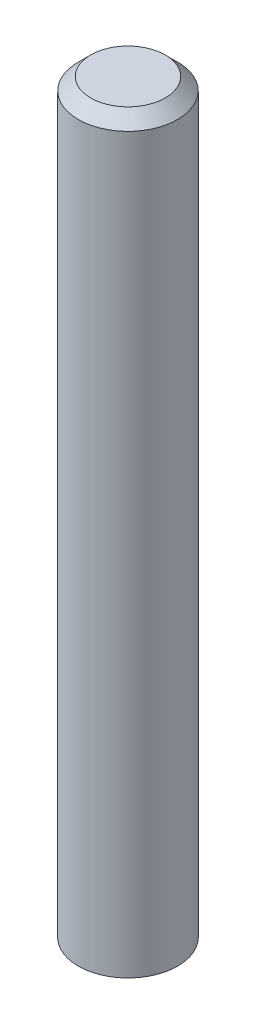
ISO-10303-21;
HEADER;
FILE_DESCRIPTION(('STEP AP214'),'2;1');
FILE_NAME('part.step','',(''),(''),'','','');
FILE_SCHEMA(('AUTOMOTIVE_DESIGN { 1 0 10303 214 1 1 1 1 }'));
ENDSEC;
DATA;
#1=APPLICATION_CONTEXT('core data for automotive mechanical design processes');
#2=APPLICATION_PROTOCOL_DEFINITION('international standard','automotive_design',2000,#1);
#3=PRODUCT_CONTEXT('',#1,'mechanical');
#4=PRODUCT('Part','Part','',(#3));
#5=PRODUCT_RELATED_PRODUCT_CATEGORY('part','',(#4));
#6=PRODUCT_DEFINITION_FORMATION('','',#4);
#7=PRODUCT_DEFINITION_CONTEXT('part definition',#1,'design');
#8=PRODUCT_DEFINITION('design','',#6,#7);
#9=PRODUCT_DEFINITION_SHAPE('','',#8);
#10=(LENGTH_UNIT() NAMED_UNIT(*) SI_UNIT(.MILLI.,.METRE.));
#11=(NAMED_UNIT(*) PLANE_ANGLE_UNIT() SI_UNIT($,.RADIAN.));
#12=(NAMED_UNIT(*) SI_UNIT($,.STERADIAN.) SOLID_ANGLE_UNIT());
#13=UNCERTAINTY_MEASURE_WITH_UNIT(LENGTH_MEASURE(1.E-05),#10,'distance_accuracy_value','');
#14=(GEOMETRIC_REPRESENTATION_CONTEXT(3) GLOBAL_UNCERTAINTY_ASSIGNED_CONTEXT((#13)) GLOBAL_UNIT_ASSIGNED_CONTEXT((#10,
#11,#12)) REPRESENTATION_CONTEXT('',''));
#15=CARTESIAN_POINT('',(0.,0.,0.));
#16=DIRECTION('',(0.,0.,1.));
#17=DIRECTION('',(1.,0.,0.));
#18=AXIS2_PLACEMENT_3D('',#15,#16,#17);
#19=CARTESIAN_POINT('',(0.,60.,0.));
#20=DIRECTION('',(0.,-1.,0.));
#21=DIRECTION('',(0.,0.,-1.));
#22=AXIS2_PLACEMENT_3D('',#19,#20,#21);
#23=CYLINDRICAL_SURFACE('',#22,4.);
#24=CARTESIAN_POINT('',(0.,59.,0.));
#25=DIRECTION('',(0.,1.,0.));
#26=DIRECTION('',(0.,0.,1.));
#27=AXIS2_PLACEMENT_3D('',#24,#25,#26);
#28=CIRCLE('',#27,4.);
#29=CARTESIAN_POINT('',(0.,59.,4.));
#30=VERTEX_POINT('',#29);
#31=EDGE_CURVE('E10',#30,#30,#28,.F.);
#32=ORIENTED_EDGE('',*,*,#31,.T.);
#33=EDGE_LOOP('',(#32));
#34=FACE_BOUND('',#33,.T.);
#35=CARTESIAN_POINT('',(0.,0.,0.));
#36=DIRECTION('',(0.,1.,0.));
#37=DIRECTION('',(0.,0.,1.));
#38=AXIS2_PLACEMENT_3D('',#35,#36,#37);
#39=CIRCLE('',#38,4.);
#40=CARTESIAN_POINT('',(0.,0.,4.));
#41=VERTEX_POINT('',#40);
#42=EDGE_CURVE('E42',#41,#41,#39,.T.);
#43=ORIENTED_EDGE('',*,*,#42,.T.);
#44=EDGE_LOOP('',(#43));
#45=FACE_BOUND('',#44,.T.);
#46=ADVANCED_FACE('F31',(#34,#45),#23,.T.);
#47=CARTESIAN_POINT('',(0.,60.,0.));
#48=DIRECTION('',(0.,1.,0.));
#49=DIRECTION('',(0.,0.,1.));
#50=AXIS2_PLACEMENT_3D('',#47,#48,#49);
#51=PLANE('',#50);
#52=CARTESIAN_POINT('',(0.,60.,0.));
#53=DIRECTION('',(0.,1.,0.));
#54=DIRECTION('',(0.,0.,1.));
#55=AXIS2_PLACEMENT_3D('',#52,#53,#54);
#56=CIRCLE('',#55,3.);
#57=CARTESIAN_POINT('',(0.,60.,3.));
#58=VERTEX_POINT('',#57);
#59=EDGE_CURVE('E38',#58,#58,#56,.T.);
#60=ORIENTED_EDGE('',*,*,#59,.T.);
#61=EDGE_LOOP('',(#60));
#62=FACE_BOUND('',#61,.T.);
#63=ADVANCED_FACE('F52',(#62),#51,.T.);
#64=CARTESIAN_POINT('',(0.,0.,0.));
#65=DIRECTION('',(0.,1.,0.));
#66=DIRECTION('',(0.,0.,1.));
#67=AXIS2_PLACEMENT_3D('',#64,#65,#66);
#68=PLANE('',#67);
#69=ORIENTED_EDGE('',*,*,#42,.F.);
#70=EDGE_LOOP('',(#69));
#71=FACE_BOUND('',#70,.T.);
#72=ADVANCED_FACE('F50',(#71),#68,.F.);
#73=CARTESIAN_POINT('',(0.,60.,0.));
#74=DIRECTION('',(0.,-1.,0.));
#75=DIRECTION('',(0.,0.,-1.));
#76=AXIS2_PLACEMENT_3D('',#73,#74,#75);
#77=CONICAL_SURFACE('',#76,3.,0.785398163397447);
#78=ORIENTED_EDGE('',*,*,#31,.F.);
#79=EDGE_LOOP('',(#78));
#80=FACE_BOUND('',#79,.T.);
#81=ORIENTED_EDGE('',*,*,#59,.F.);
#82=EDGE_LOOP('',(#81));
#83=FACE_BOUND('',#82,.T.);
#84=ADVANCED_FACE('F33',(#80,#83),#77,.T.);
#85=CLOSED_SHELL('',(#46,#63,#72,#84));
#86=MANIFOLD_SOLID_BREP('B2',#85);
#87=ADVANCED_BREP_SHAPE_REPRESENTATION('',(#18,#86),#14);
#88=SHAPE_DEFINITION_REPRESENTATION(#9,#87);
ENDSEC;
END-ISO-10303-21;
